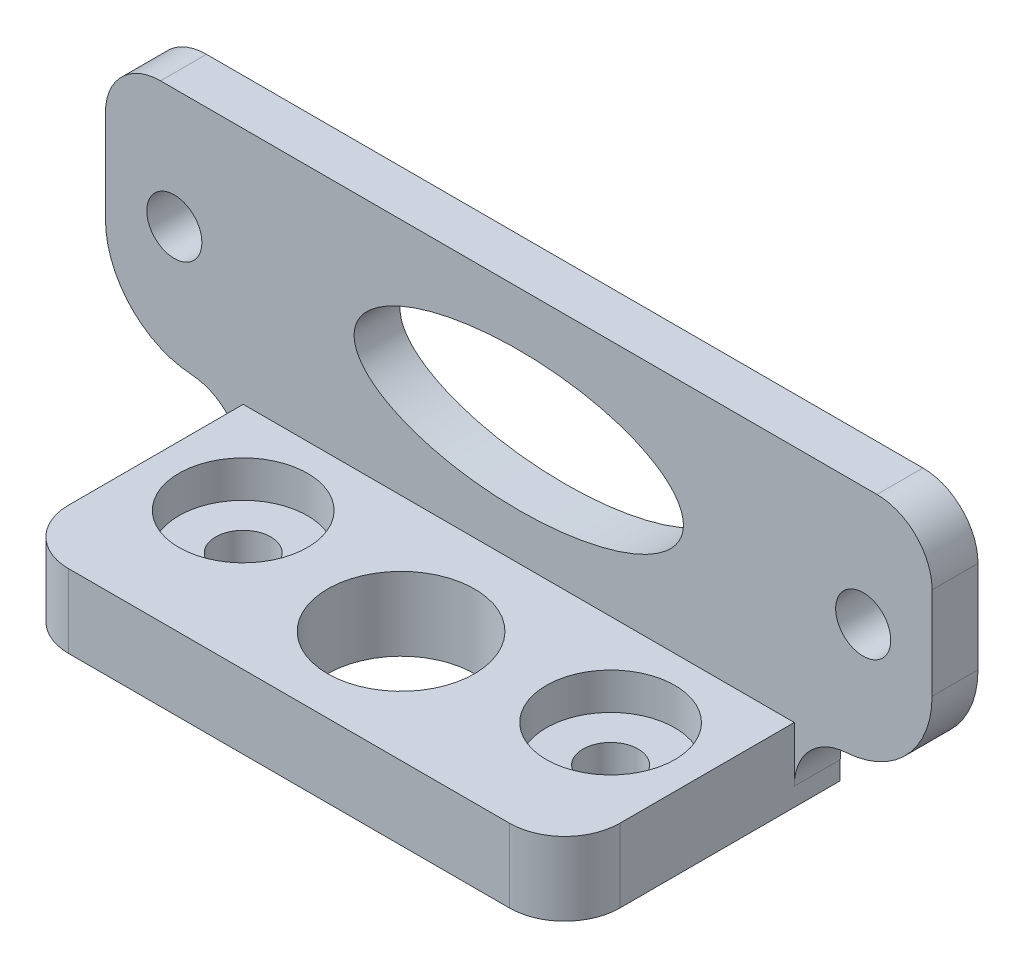
ISO-10303-21;
HEADER;
FILE_DESCRIPTION(('STEP AP214'),'2;1');
FILE_NAME('part.step','',(''),(''),'','','');
FILE_SCHEMA(('AUTOMOTIVE_DESIGN { 1 0 10303 214 1 1 1 1 }'));
ENDSEC;
DATA;
#1=APPLICATION_CONTEXT('core data for automotive mechanical design processes');
#2=APPLICATION_PROTOCOL_DEFINITION('international standard','automotive_design',2000,#1);
#3=PRODUCT_CONTEXT('',#1,'mechanical');
#4=PRODUCT('Part','Part','',(#3));
#5=PRODUCT_RELATED_PRODUCT_CATEGORY('part','',(#4));
#6=PRODUCT_DEFINITION_FORMATION('','',#4);
#7=PRODUCT_DEFINITION_CONTEXT('part definition',#1,'design');
#8=PRODUCT_DEFINITION('design','',#6,#7);
#9=PRODUCT_DEFINITION_SHAPE('','',#8);
#10=(LENGTH_UNIT() NAMED_UNIT(*) SI_UNIT(.MILLI.,.METRE.));
#11=(NAMED_UNIT(*) PLANE_ANGLE_UNIT() SI_UNIT($,.RADIAN.));
#12=(NAMED_UNIT(*) SI_UNIT($,.STERADIAN.) SOLID_ANGLE_UNIT());
#13=UNCERTAINTY_MEASURE_WITH_UNIT(LENGTH_MEASURE(1.E-05),#10,'distance_accuracy_value','');
#14=(GEOMETRIC_REPRESENTATION_CONTEXT(3) GLOBAL_UNCERTAINTY_ASSIGNED_CONTEXT((#13)) GLOBAL_UNIT_ASSIGNED_CONTEXT((#10,
#11,#12)) REPRESENTATION_CONTEXT('',''));
#15=CARTESIAN_POINT('',(0.,0.,0.));
#16=DIRECTION('',(0.,0.,1.));
#17=DIRECTION('',(1.,0.,0.));
#18=AXIS2_PLACEMENT_3D('',#15,#16,#17);
#19=CARTESIAN_POINT('',(-10.,-21.,0.));
#20=DIRECTION('',(0.,1.,0.));
#21=DIRECTION('',(0.,0.,1.));
#22=AXIS2_PLACEMENT_3D('',#19,#20,#21);
#23=CYLINDRICAL_SURFACE('',#22,1.5);
#24=CARTESIAN_POINT('',(-10.,0.,0.));
#25=DIRECTION('',(0.,1.,0.));
#26=DIRECTION('',(0.,0.,1.));
#27=AXIS2_PLACEMENT_3D('',#24,#25,#26);
#28=CIRCLE('',#27,1.5);
#29=CARTESIAN_POINT('',(-10.,0.,1.5));
#30=VERTEX_POINT('',#29);
#31=EDGE_CURVE('E263',#30,#30,#28,.T.);
#32=ORIENTED_EDGE('',*,*,#31,.F.);
#33=EDGE_LOOP('',(#32));
#34=FACE_BOUND('',#33,.T.);
#35=CARTESIAN_POINT('',(-10.,2.,0.));
#36=DIRECTION('',(0.,1.,0.));
#37=DIRECTION('',(0.,0.,1.));
#38=AXIS2_PLACEMENT_3D('',#35,#36,#37);
#39=CIRCLE('',#38,1.5);
#40=CARTESIAN_POINT('',(-10.,2.,1.5));
#41=VERTEX_POINT('',#40);
#42=EDGE_CURVE('E270',#41,#41,#39,.F.);
#43=ORIENTED_EDGE('',*,*,#42,.F.);
#44=EDGE_LOOP('',(#43));
#45=FACE_BOUND('',#44,.T.);
#46=ADVANCED_FACE('F34',(#34,#45),#23,.F.);
#47=CARTESIAN_POINT('',(10.,-21.,0.));
#48=DIRECTION('',(0.,1.,0.));
#49=DIRECTION('',(0.,0.,1.));
#50=AXIS2_PLACEMENT_3D('',#47,#48,#49);
#51=CYLINDRICAL_SURFACE('',#50,1.5);
#52=CARTESIAN_POINT('',(10.,0.,0.));
#53=DIRECTION('',(0.,1.,0.));
#54=DIRECTION('',(0.,0.,1.));
#55=AXIS2_PLACEMENT_3D('',#52,#53,#54);
#56=CIRCLE('',#55,1.5);
#57=CARTESIAN_POINT('',(10.,0.,1.5));
#58=VERTEX_POINT('',#57);
#59=EDGE_CURVE('E259',#58,#58,#56,.T.);
#60=ORIENTED_EDGE('',*,*,#59,.F.);
#61=EDGE_LOOP('',(#60));
#62=FACE_BOUND('',#61,.T.);
#63=CARTESIAN_POINT('',(10.,2.,0.));
#64=DIRECTION('',(0.,1.,0.));
#65=DIRECTION('',(0.,0.,1.));
#66=AXIS2_PLACEMENT_3D('',#63,#64,#65);
#67=CIRCLE('',#66,1.5);
#68=CARTESIAN_POINT('',(10.,2.,1.5));
#69=VERTEX_POINT('',#68);
#70=EDGE_CURVE('E266',#69,#69,#67,.F.);
#71=ORIENTED_EDGE('',*,*,#70,.F.);
#72=EDGE_LOOP('',(#71));
#73=FACE_BOUND('',#72,.T.);
#74=ADVANCED_FACE('F361',(#62,#73),#51,.F.);
#75=CARTESIAN_POINT('',(15.,4.,-7.5));
#76=DIRECTION('',(-1.,0.,0.));
#77=DIRECTION('',(0.,0.,1.));
#78=AXIS2_PLACEMENT_3D('',#75,#76,#77);
#79=PLANE('',#78);
#80=DIRECTION('',(0.,0.,-1.));
#81=VECTOR('',#80,1.);
#82=CARTESIAN_POINT('',(15.,4.,-7.5));
#83=LINE('',#82,#81);
#84=CARTESIAN_POINT('',(15.,4.,4.5));
#85=VERTEX_POINT('',#84);
#86=CARTESIAN_POINT('',(15.,4.,-5.));
#87=VERTEX_POINT('',#86);
#88=EDGE_CURVE('E151',#85,#87,#83,.T.);
#89=ORIENTED_EDGE('',*,*,#88,.F.);
#90=DIRECTION('',(0.,-1.,0.));
#91=VECTOR('',#90,1.);
#92=CARTESIAN_POINT('',(15.,4.,4.5));
#93=LINE('',#92,#91);
#94=CARTESIAN_POINT('',(15.,0.,4.5));
#95=VERTEX_POINT('',#94);
#96=EDGE_CURVE('E229',#85,#95,#93,.T.);
#97=ORIENTED_EDGE('',*,*,#96,.T.);
#98=DIRECTION('',(0.,0.,-1.));
#99=VECTOR('',#98,1.);
#100=CARTESIAN_POINT('',(15.,0.,-7.5));
#101=LINE('',#100,#99);
#102=CARTESIAN_POINT('',(15.,0.,-7.5));
#103=VERTEX_POINT('',#102);
#104=EDGE_CURVE('E198',#95,#103,#101,.T.);
#105=ORIENTED_EDGE('',*,*,#104,.T.);
#106=DIRECTION('',(0.,-1.,0.));
#107=VECTOR('',#106,1.);
#108=CARTESIAN_POINT('',(15.,4.,-7.5));
#109=LINE('',#108,#107);
#110=CARTESIAN_POINT('',(15.,1.,-7.5));
#111=VERTEX_POINT('',#110);
#112=EDGE_CURVE('E179',#111,#103,#109,.T.);
#113=ORIENTED_EDGE('',*,*,#112,.F.);
#114=DIRECTION('',(0.,0.,-1.));
#115=VECTOR('',#114,1.);
#116=CARTESIAN_POINT('',(15.,1.,-5.));
#117=LINE('',#116,#115);
#118=CARTESIAN_POINT('',(15.,1.,-5.));
#119=VERTEX_POINT('',#118);
#120=EDGE_CURVE('E155',#111,#119,#117,.F.);
#121=ORIENTED_EDGE('',*,*,#120,.T.);
#122=DIRECTION('',(0.,1.,0.));
#123=VECTOR('',#122,1.);
#124=CARTESIAN_POINT('',(15.,17.,-5.));
#125=LINE('',#124,#123);
#126=EDGE_CURVE('E147',#119,#87,#125,.T.);
#127=ORIENTED_EDGE('',*,*,#126,.T.);
#128=EDGE_LOOP('',(#89,#97,#105,#113,#121,#127));
#129=FACE_BOUND('',#128,.T.);
#130=ADVANCED_FACE('F149',(#129),#79,.F.);
#131=CARTESIAN_POINT('',(-15.,4.,-7.5));
#132=DIRECTION('',(0.,0.,1.));
#133=DIRECTION('',(1.,0.,0.));
#134=AXIS2_PLACEMENT_3D('',#131,#132,#133);
#135=PLANE('',#134);
#136=CARTESIAN_POINT('',(0.,10.2840234102692,-7.5));
#137=DIRECTION('',(0.,0.,1.));
#138=DIRECTION('',(1.,0.,0.));
#139=AXIS2_PLACEMENT_3D('',#136,#137,#138);
#140=ELLIPSE('',#139,8.96209407276448,3.77793192762906);
#141=CARTESIAN_POINT('',(8.96209407276448,10.2840234102692,-7.5));
#142=VERTEX_POINT('',#141);
#143=EDGE_CURVE('E324',#142,#142,#140,.T.);
#144=ORIENTED_EDGE('',*,*,#143,.T.);
#145=EDGE_LOOP('',(#144));
#146=FACE_BOUND('',#145,.T.);
#147=CARTESIAN_POINT('',(-18.75,10.5,-7.5));
#148=DIRECTION('',(0.,0.,1.));
#149=DIRECTION('',(1.,0.,0.));
#150=AXIS2_PLACEMENT_3D('',#147,#148,#149);
#151=CIRCLE('',#150,1.5);
#152=CARTESIAN_POINT('',(-17.25,10.5,-7.5));
#153=VERTEX_POINT('',#152);
#154=EDGE_CURVE('E312',#153,#153,#151,.T.);
#155=ORIENTED_EDGE('',*,*,#154,.T.);
#156=EDGE_LOOP('',(#155));
#157=FACE_BOUND('',#156,.T.);
#158=CARTESIAN_POINT('',(18.75,10.5,-7.5));
#159=DIRECTION('',(0.,0.,1.));
#160=DIRECTION('',(1.,0.,0.));
#161=AXIS2_PLACEMENT_3D('',#158,#159,#160);
#162=CIRCLE('',#161,1.5);
#163=CARTESIAN_POINT('',(20.25,10.5,-7.5));
#164=VERTEX_POINT('',#163);
#165=EDGE_CURVE('E305',#164,#164,#162,.T.);
#166=ORIENTED_EDGE('',*,*,#165,.T.);
#167=EDGE_LOOP('',(#166));
#168=FACE_BOUND('',#167,.T.);
#169=CARTESIAN_POINT('',(-18.,1.,-7.5));
#170=DIRECTION('',(0.,0.,1.));
#171=DIRECTION('',(1.,0.,0.));
#172=AXIS2_PLACEMENT_3D('',#169,#170,#171);
#173=CIRCLE('',#172,3.);
#174=CARTESIAN_POINT('',(-15.,1.,-7.5));
#175=VERTEX_POINT('',#174);
#176=CARTESIAN_POINT('',(-17.8125,3.99413489175087,-7.5));
#177=VERTEX_POINT('',#176);
#178=EDGE_CURVE('E255',#175,#177,#173,.T.);
#179=ORIENTED_EDGE('',*,*,#178,.T.);
#180=CARTESIAN_POINT('',(-17.5,8.98435971133565,-7.5));
#181=DIRECTION('',(0.,0.,1.));
#182=DIRECTION('',(1.,0.,0.));
#183=AXIS2_PLACEMENT_3D('',#180,#181,#182);
#184=CIRCLE('',#183,5.);
#185=CARTESIAN_POINT('',(-22.5,8.98435971133566,-7.5));
#186=VERTEX_POINT('',#185);
#187=EDGE_CURVE('E284',#177,#186,#184,.F.);
#188=ORIENTED_EDGE('',*,*,#187,.T.);
#189=DIRECTION('',(0.,-1.,0.));
#190=VECTOR('',#189,1.);
#191=CARTESIAN_POINT('',(-22.5,17.,-7.5));
#192=LINE('',#191,#190);
#193=CARTESIAN_POINT('',(-22.5,14.,-7.5));
#194=VERTEX_POINT('',#193);
#195=EDGE_CURVE('E194',#194,#186,#192,.T.);
#196=ORIENTED_EDGE('',*,*,#195,.F.);
#197=CARTESIAN_POINT('',(-19.5,14.,-7.5));
#198=DIRECTION('',(0.,0.,1.));
#199=DIRECTION('',(1.,0.,0.));
#200=AXIS2_PLACEMENT_3D('',#197,#198,#199);
#201=CIRCLE('',#200,3.);
#202=CARTESIAN_POINT('',(-19.5,17.,-7.5));
#203=VERTEX_POINT('',#202);
#204=EDGE_CURVE('E245',#194,#203,#201,.F.);
#205=ORIENTED_EDGE('',*,*,#204,.T.);
#206=DIRECTION('',(-1.,0.,0.));
#207=VECTOR('',#206,1.);
#208=CARTESIAN_POINT('',(-22.5,17.,-7.5));
#209=LINE('',#208,#207);
#210=CARTESIAN_POINT('',(19.5,17.,-7.5));
#211=VERTEX_POINT('',#210);
#212=EDGE_CURVE('E295',#211,#203,#209,.T.);
#213=ORIENTED_EDGE('',*,*,#212,.F.);
#214=CARTESIAN_POINT('',(19.5,14.,-7.5));
#215=DIRECTION('',(0.,0.,1.));
#216=DIRECTION('',(1.,0.,0.));
#217=AXIS2_PLACEMENT_3D('',#214,#215,#216);
#218=CIRCLE('',#217,3.);
#219=CARTESIAN_POINT('',(22.5,14.,-7.5));
#220=VERTEX_POINT('',#219);
#221=EDGE_CURVE('E243',#211,#220,#218,.F.);
#222=ORIENTED_EDGE('',*,*,#221,.T.);
#223=DIRECTION('',(0.,-1.,0.));
#224=VECTOR('',#223,1.);
#225=CARTESIAN_POINT('',(22.5,17.,-7.5));
#226=LINE('',#225,#224);
#227=CARTESIAN_POINT('',(22.5,8.98435971133566,-7.5));
#228=VERTEX_POINT('',#227);
#229=EDGE_CURVE('E197',#220,#228,#226,.T.);
#230=ORIENTED_EDGE('',*,*,#229,.T.);
#231=CARTESIAN_POINT('',(17.5,8.98435971133565,-7.5));
#232=DIRECTION('',(0.,0.,1.));
#233=DIRECTION('',(1.,0.,0.));
#234=AXIS2_PLACEMENT_3D('',#231,#232,#233);
#235=CIRCLE('',#234,5.);
#236=CARTESIAN_POINT('',(17.8125,3.99413489175087,-7.5));
#237=VERTEX_POINT('',#236);
#238=EDGE_CURVE('E50',#228,#237,#235,.F.);
#239=ORIENTED_EDGE('',*,*,#238,.T.);
#240=CARTESIAN_POINT('',(18.,1.,-7.5));
#241=DIRECTION('',(0.,0.,1.));
#242=DIRECTION('',(1.,0.,0.));
#243=AXIS2_PLACEMENT_3D('',#240,#241,#242);
#244=CIRCLE('',#243,3.);
#245=EDGE_CURVE('E249',#237,#111,#244,.T.);
#246=ORIENTED_EDGE('',*,*,#245,.T.);
#247=ORIENTED_EDGE('',*,*,#112,.T.);
#248=DIRECTION('',(-1.,0.,0.));
#249=VECTOR('',#248,1.);
#250=CARTESIAN_POINT('',(-15.,0.,-7.5));
#251=LINE('',#250,#249);
#252=CARTESIAN_POINT('',(-15.,0.,-7.5));
#253=VERTEX_POINT('',#252);
#254=EDGE_CURVE('E205',#103,#253,#251,.T.);
#255=ORIENTED_EDGE('',*,*,#254,.T.);
#256=DIRECTION('',(0.,-1.,0.));
#257=VECTOR('',#256,1.);
#258=CARTESIAN_POINT('',(-15.,4.,-7.5));
#259=LINE('',#258,#257);
#260=EDGE_CURVE('E183',#175,#253,#259,.T.);
#261=ORIENTED_EDGE('',*,*,#260,.F.);
#262=EDGE_LOOP('',(#179,#188,#196,#205,#213,#222,#230,#239,#246,#247,#255,#261));
#263=FACE_BOUND('',#262,.T.);
#264=ADVANCED_FACE('F292',(#146,#157,#168,#263),#135,.F.);
#265=CARTESIAN_POINT('',(-15.,4.,-7.5));
#266=DIRECTION('',(1.,0.,0.));
#267=DIRECTION('',(0.,0.,-1.));
#268=AXIS2_PLACEMENT_3D('',#265,#266,#267);
#269=PLANE('',#268);
#270=DIRECTION('',(0.,0.,1.));
#271=VECTOR('',#270,1.);
#272=CARTESIAN_POINT('',(-15.,0.,-7.5));
#273=LINE('',#272,#271);
#274=CARTESIAN_POINT('',(-15.,0.,4.5));
#275=VERTEX_POINT('',#274);
#276=EDGE_CURVE('E208',#253,#275,#273,.T.);
#277=ORIENTED_EDGE('',*,*,#276,.T.);
#278=DIRECTION('',(0.,-1.,0.));
#279=VECTOR('',#278,1.);
#280=CARTESIAN_POINT('',(-15.,4.,4.5));
#281=LINE('',#280,#279);
#282=CARTESIAN_POINT('',(-15.,4.,4.5));
#283=VERTEX_POINT('',#282);
#284=EDGE_CURVE('E224',#275,#283,#281,.F.);
#285=ORIENTED_EDGE('',*,*,#284,.T.);
#286=DIRECTION('',(0.,0.,1.));
#287=VECTOR('',#286,1.);
#288=CARTESIAN_POINT('',(-15.,4.,-7.5));
#289=LINE('',#288,#287);
#290=CARTESIAN_POINT('',(-15.,4.,-5.));
#291=VERTEX_POINT('',#290);
#292=EDGE_CURVE('E170',#291,#283,#289,.T.);
#293=ORIENTED_EDGE('',*,*,#292,.F.);
#294=DIRECTION('',(0.,-1.,0.));
#295=VECTOR('',#294,1.);
#296=CARTESIAN_POINT('',(-15.,17.,-5.));
#297=LINE('',#296,#295);
#298=CARTESIAN_POINT('',(-15.,1.,-5.));
#299=VERTEX_POINT('',#298);
#300=EDGE_CURVE('E176',#291,#299,#297,.T.);
#301=ORIENTED_EDGE('',*,*,#300,.T.);
#302=DIRECTION('',(0.,0.,1.));
#303=VECTOR('',#302,1.);
#304=CARTESIAN_POINT('',(-15.,1.,-7.5));
#305=LINE('',#304,#303);
#306=EDGE_CURVE('E221',#299,#175,#305,.F.);
#307=ORIENTED_EDGE('',*,*,#306,.T.);
#308=ORIENTED_EDGE('',*,*,#260,.T.);
#309=EDGE_LOOP('',(#277,#285,#293,#301,#307,#308));
#310=FACE_BOUND('',#309,.T.);
#311=ADVANCED_FACE('F396',(#310),#269,.F.);
#312=CARTESIAN_POINT('',(-15.,4.,7.5));
#313=DIRECTION('',(0.,0.,-1.));
#314=DIRECTION('',(-1.,0.,0.));
#315=AXIS2_PLACEMENT_3D('',#312,#313,#314);
#316=PLANE('',#315);
#317=DIRECTION('',(1.,0.,0.));
#318=VECTOR('',#317,1.);
#319=CARTESIAN_POINT('',(-15.,4.,7.5));
#320=LINE('',#319,#318);
#321=CARTESIAN_POINT('',(-12.,4.,7.5));
#322=VERTEX_POINT('',#321);
#323=CARTESIAN_POINT('',(12.,4.,7.5));
#324=VERTEX_POINT('',#323);
#325=EDGE_CURVE('E201',#322,#324,#320,.T.);
#326=ORIENTED_EDGE('',*,*,#325,.F.);
#327=DIRECTION('',(0.,-1.,0.));
#328=VECTOR('',#327,1.);
#329=CARTESIAN_POINT('',(-12.,4.,7.5));
#330=LINE('',#329,#328);
#331=CARTESIAN_POINT('',(-12.,0.,7.5));
#332=VERTEX_POINT('',#331);
#333=EDGE_CURVE('E181',#322,#332,#330,.T.);
#334=ORIENTED_EDGE('',*,*,#333,.T.);
#335=DIRECTION('',(1.,0.,0.));
#336=VECTOR('',#335,1.);
#337=CARTESIAN_POINT('',(-15.,0.,7.5));
#338=LINE('',#337,#336);
#339=CARTESIAN_POINT('',(12.,0.,7.5));
#340=VERTEX_POINT('',#339);
#341=EDGE_CURVE('E171',#332,#340,#338,.T.);
#342=ORIENTED_EDGE('',*,*,#341,.T.);
#343=DIRECTION('',(0.,-1.,0.));
#344=VECTOR('',#343,1.);
#345=CARTESIAN_POINT('',(12.,4.,7.5));
#346=LINE('',#345,#344);
#347=EDGE_CURVE('E178',#340,#324,#346,.F.);
#348=ORIENTED_EDGE('',*,*,#347,.T.);
#349=EDGE_LOOP('',(#326,#334,#342,#348));
#350=FACE_BOUND('',#349,.T.);
#351=ADVANCED_FACE('F389',(#350),#316,.F.);
#352=CARTESIAN_POINT('',(0.,4.,0.));
#353=DIRECTION('',(0.,1.,0.));
#354=DIRECTION('',(0.,0.,1.));
#355=AXIS2_PLACEMENT_3D('',#352,#353,#354);
#356=PLANE('',#355);
#357=CARTESIAN_POINT('',(0.,4.,1.4062302175064));
#358=DIRECTION('',(0.,1.,0.));
#359=DIRECTION('',(0.,0.,1.));
#360=AXIS2_PLACEMENT_3D('',#357,#358,#359);
#361=CIRCLE('',#360,4.);
#362=CARTESIAN_POINT('',(0.,4.,5.4062302175064));
#363=VERTEX_POINT('',#362);
#364=EDGE_CURVE('E334',#363,#363,#361,.T.);
#365=ORIENTED_EDGE('',*,*,#364,.F.);
#366=EDGE_LOOP('',(#365));
#367=FACE_BOUND('',#366,.T.);
#368=CARTESIAN_POINT('',(-10.,4.,0.));
#369=DIRECTION('',(0.,1.,0.));
#370=DIRECTION('',(0.,0.,1.));
#371=AXIS2_PLACEMENT_3D('',#368,#369,#370);
#372=CIRCLE('',#371,3.5);
#373=CARTESIAN_POINT('',(-10.,4.,3.5));
#374=VERTEX_POINT('',#373);
#375=EDGE_CURVE('E321',#374,#374,#372,.T.);
#376=ORIENTED_EDGE('',*,*,#375,.F.);
#377=EDGE_LOOP('',(#376));
#378=FACE_BOUND('',#377,.T.);
#379=CARTESIAN_POINT('',(10.,4.,0.));
#380=DIRECTION('',(0.,1.,0.));
#381=DIRECTION('',(0.,0.,1.));
#382=AXIS2_PLACEMENT_3D('',#379,#380,#381);
#383=CIRCLE('',#382,3.5);
#384=CARTESIAN_POINT('',(10.,4.,3.5));
#385=VERTEX_POINT('',#384);
#386=EDGE_CURVE('E273',#385,#385,#383,.T.);
#387=ORIENTED_EDGE('',*,*,#386,.F.);
#388=EDGE_LOOP('',(#387));
#389=FACE_BOUND('',#388,.T.);
#390=ORIENTED_EDGE('',*,*,#292,.T.);
#391=CARTESIAN_POINT('',(-12.,4.,4.5));
#392=DIRECTION('',(0.,1.,0.));
#393=DIRECTION('',(0.,0.,1.));
#394=AXIS2_PLACEMENT_3D('',#391,#392,#393);
#395=CIRCLE('',#394,3.);
#396=EDGE_CURVE('E160',#283,#322,#395,.T.);
#397=ORIENTED_EDGE('',*,*,#396,.T.);
#398=ORIENTED_EDGE('',*,*,#325,.T.);
#399=CARTESIAN_POINT('',(12.,4.,4.5));
#400=DIRECTION('',(0.,1.,0.));
#401=DIRECTION('',(0.,0.,1.));
#402=AXIS2_PLACEMENT_3D('',#399,#400,#401);
#403=CIRCLE('',#402,3.);
#404=EDGE_CURVE('E169',#324,#85,#403,.T.);
#405=ORIENTED_EDGE('',*,*,#404,.T.);
#406=ORIENTED_EDGE('',*,*,#88,.T.);
#407=DIRECTION('',(1.,0.,0.));
#408=VECTOR('',#407,1.);
#409=CARTESIAN_POINT('',(-22.5,4.,-5.));
#410=LINE('',#409,#408);
#411=EDGE_CURVE('E166',#291,#87,#410,.T.);
#412=ORIENTED_EDGE('',*,*,#411,.F.);
#413=EDGE_LOOP('',(#390,#397,#398,#405,#406,#412));
#414=FACE_BOUND('',#413,.T.);
#415=ADVANCED_FACE('F165',(#367,#378,#389,#414),#356,.T.);
#416=CARTESIAN_POINT('',(0.,0.,0.));
#417=DIRECTION('',(0.,1.,0.));
#418=DIRECTION('',(0.,0.,1.));
#419=AXIS2_PLACEMENT_3D('',#416,#417,#418);
#420=PLANE('',#419);
#421=CARTESIAN_POINT('',(0.,0.,1.4062302175064));
#422=DIRECTION('',(0.,1.,0.));
#423=DIRECTION('',(0.,0.,1.));
#424=AXIS2_PLACEMENT_3D('',#421,#422,#423);
#425=CIRCLE('',#424,4.);
#426=CARTESIAN_POINT('',(0.,0.,5.4062302175064));
#427=VERTEX_POINT('',#426);
#428=EDGE_CURVE('E38',#427,#427,#425,.T.);
#429=ORIENTED_EDGE('',*,*,#428,.T.);
#430=EDGE_LOOP('',(#429));
#431=FACE_BOUND('',#430,.T.);
#432=ORIENTED_EDGE('',*,*,#31,.T.);
#433=EDGE_LOOP('',(#432));
#434=FACE_BOUND('',#433,.T.);
#435=ORIENTED_EDGE('',*,*,#59,.T.);
#436=EDGE_LOOP('',(#435));
#437=FACE_BOUND('',#436,.T.);
#438=ORIENTED_EDGE('',*,*,#341,.F.);
#439=CARTESIAN_POINT('',(-12.,0.,4.5));
#440=DIRECTION('',(0.,1.,0.));
#441=DIRECTION('',(0.,0.,1.));
#442=AXIS2_PLACEMENT_3D('',#439,#440,#441);
#443=CIRCLE('',#442,3.);
#444=EDGE_CURVE('E219',#332,#275,#443,.F.);
#445=ORIENTED_EDGE('',*,*,#444,.T.);
#446=ORIENTED_EDGE('',*,*,#276,.F.);
#447=ORIENTED_EDGE('',*,*,#254,.F.);
#448=ORIENTED_EDGE('',*,*,#104,.F.);
#449=CARTESIAN_POINT('',(12.,0.,4.5));
#450=DIRECTION('',(0.,1.,0.));
#451=DIRECTION('',(0.,0.,1.));
#452=AXIS2_PLACEMENT_3D('',#449,#450,#451);
#453=CIRCLE('',#452,3.);
#454=EDGE_CURVE('E453',#95,#340,#453,.F.);
#455=ORIENTED_EDGE('',*,*,#454,.T.);
#456=EDGE_LOOP('',(#438,#445,#446,#447,#448,#455));
#457=FACE_BOUND('',#456,.T.);
#458=ADVANCED_FACE('F386',(#431,#434,#437,#457),#420,.F.);
#459=CARTESIAN_POINT('',(22.5,17.,-7.5));
#460=DIRECTION('',(-1.,0.,0.));
#461=DIRECTION('',(0.,0.,1.));
#462=AXIS2_PLACEMENT_3D('',#459,#460,#461);
#463=PLANE('',#462);
#464=DIRECTION('',(0.,-1.,0.));
#465=VECTOR('',#464,1.);
#466=CARTESIAN_POINT('',(22.5,17.,-5.));
#467=LINE('',#466,#465);
#468=CARTESIAN_POINT('',(22.5,14.,-5.));
#469=VERTEX_POINT('',#468);
#470=CARTESIAN_POINT('',(22.5,8.98435971133566,-5.));
#471=VERTEX_POINT('',#470);
#472=EDGE_CURVE('E189',#469,#471,#467,.T.);
#473=ORIENTED_EDGE('',*,*,#472,.T.);
#474=DIRECTION('',(0.,0.,1.));
#475=VECTOR('',#474,1.);
#476=CARTESIAN_POINT('',(22.5,8.98435971133565,-7.5));
#477=LINE('',#476,#475);
#478=EDGE_CURVE('E43',#471,#228,#477,.F.);
#479=ORIENTED_EDGE('',*,*,#478,.T.);
#480=ORIENTED_EDGE('',*,*,#229,.F.);
#481=DIRECTION('',(0.,0.,-1.));
#482=VECTOR('',#481,1.);
#483=CARTESIAN_POINT('',(22.5,14.,-5.));
#484=LINE('',#483,#482);
#485=EDGE_CURVE('E247',#220,#469,#484,.F.);
#486=ORIENTED_EDGE('',*,*,#485,.T.);
#487=EDGE_LOOP('',(#473,#479,#480,#486));
#488=FACE_BOUND('',#487,.T.);
#489=ADVANCED_FACE('F288',(#488),#463,.F.);
#490=CARTESIAN_POINT('',(-22.5,17.,-7.5));
#491=DIRECTION('',(1.,0.,0.));
#492=DIRECTION('',(0.,0.,-1.));
#493=AXIS2_PLACEMENT_3D('',#490,#491,#492);
#494=PLANE('',#493);
#495=ORIENTED_EDGE('',*,*,#195,.T.);
#496=DIRECTION('',(0.,0.,-1.));
#497=VECTOR('',#496,1.);
#498=CARTESIAN_POINT('',(-22.5,8.98435971133565,-7.5));
#499=LINE('',#498,#497);
#500=CARTESIAN_POINT('',(-22.5,8.98435971133566,-5.));
#501=VERTEX_POINT('',#500);
#502=EDGE_CURVE('E258',#186,#501,#499,.F.);
#503=ORIENTED_EDGE('',*,*,#502,.T.);
#504=DIRECTION('',(0.,-1.,0.));
#505=VECTOR('',#504,1.);
#506=CARTESIAN_POINT('',(-22.5,17.,-5.));
#507=LINE('',#506,#505);
#508=CARTESIAN_POINT('',(-22.5,14.,-5.));
#509=VERTEX_POINT('',#508);
#510=EDGE_CURVE('E192',#509,#501,#507,.T.);
#511=ORIENTED_EDGE('',*,*,#510,.F.);
#512=DIRECTION('',(0.,0.,1.));
#513=VECTOR('',#512,1.);
#514=CARTESIAN_POINT('',(-22.5,14.,-7.5));
#515=LINE('',#514,#513);
#516=EDGE_CURVE('E241',#509,#194,#515,.F.);
#517=ORIENTED_EDGE('',*,*,#516,.T.);
#518=EDGE_LOOP('',(#495,#503,#511,#517));
#519=FACE_BOUND('',#518,.T.);
#520=ADVANCED_FACE('F379',(#519),#494,.F.);
#521=CARTESIAN_POINT('',(-22.5,17.,-5.));
#522=DIRECTION('',(0.,0.,-1.));
#523=DIRECTION('',(-1.,0.,0.));
#524=AXIS2_PLACEMENT_3D('',#521,#522,#523);
#525=PLANE('',#524);
#526=CARTESIAN_POINT('',(0.,10.2840234102692,-5.));
#527=DIRECTION('',(0.,0.,1.));
#528=DIRECTION('',(1.,0.,0.));
#529=AXIS2_PLACEMENT_3D('',#526,#527,#528);
#530=ELLIPSE('',#529,8.96209407276448,3.77793192762906);
#531=CARTESIAN_POINT('',(8.96209407276448,10.2840234102692,-5.));
#532=VERTEX_POINT('',#531);
#533=EDGE_CURVE('E329',#532,#532,#530,.T.);
#534=ORIENTED_EDGE('',*,*,#533,.F.);
#535=EDGE_LOOP('',(#534));
#536=FACE_BOUND('',#535,.T.);
#537=CARTESIAN_POINT('',(-18.75,10.5,-5.));
#538=DIRECTION('',(0.,0.,1.));
#539=DIRECTION('',(-1.,0.,0.));
#540=AXIS2_PLACEMENT_3D('',#537,#538,#539);
#541=CIRCLE('',#540,1.5);
#542=CARTESIAN_POINT('',(-20.25,10.5,-5.));
#543=VERTEX_POINT('',#542);
#544=EDGE_CURVE('E262',#543,#543,#541,.T.);
#545=ORIENTED_EDGE('',*,*,#544,.F.);
#546=EDGE_LOOP('',(#545));
#547=FACE_BOUND('',#546,.T.);
#548=CARTESIAN_POINT('',(18.75,10.5,-5.));
#549=DIRECTION('',(0.,0.,1.));
#550=DIRECTION('',(1.,0.,0.));
#551=AXIS2_PLACEMENT_3D('',#548,#549,#550);
#552=CIRCLE('',#551,1.5);
#553=CARTESIAN_POINT('',(20.25,10.5,-5.));
#554=VERTEX_POINT('',#553);
#555=EDGE_CURVE('E307',#554,#554,#552,.T.);
#556=ORIENTED_EDGE('',*,*,#555,.F.);
#557=EDGE_LOOP('',(#556));
#558=FACE_BOUND('',#557,.T.);
#559=ORIENTED_EDGE('',*,*,#510,.T.);
#560=CARTESIAN_POINT('',(-17.5,8.98435971133565,-5.));
#561=DIRECTION('',(0.,0.,-1.));
#562=DIRECTION('',(-1.,0.,0.));
#563=AXIS2_PLACEMENT_3D('',#560,#561,#562);
#564=CIRCLE('',#563,5.);
#565=CARTESIAN_POINT('',(-17.8125,3.99413489175087,-5.));
#566=VERTEX_POINT('',#565);
#567=EDGE_CURVE('E279',#501,#566,#564,.F.);
#568=ORIENTED_EDGE('',*,*,#567,.T.);
#569=CARTESIAN_POINT('',(-18.,1.,-5.));
#570=DIRECTION('',(0.,0.,-1.));
#571=DIRECTION('',(-1.,0.,0.));
#572=AXIS2_PLACEMENT_3D('',#569,#570,#571);
#573=CIRCLE('',#572,3.);
#574=EDGE_CURVE('E253',#566,#299,#573,.T.);
#575=ORIENTED_EDGE('',*,*,#574,.T.);
#576=ORIENTED_EDGE('',*,*,#300,.F.);
#577=ORIENTED_EDGE('',*,*,#411,.T.);
#578=ORIENTED_EDGE('',*,*,#126,.F.);
#579=CARTESIAN_POINT('',(18.,1.,-5.));
#580=DIRECTION('',(0.,0.,-1.));
#581=DIRECTION('',(-1.,0.,0.));
#582=AXIS2_PLACEMENT_3D('',#579,#580,#581);
#583=CIRCLE('',#582,3.);
#584=CARTESIAN_POINT('',(17.8125,3.99413489175087,-5.));
#585=VERTEX_POINT('',#584);
#586=EDGE_CURVE('E251',#119,#585,#583,.T.);
#587=ORIENTED_EDGE('',*,*,#586,.T.);
#588=CARTESIAN_POINT('',(17.5,8.98435971133565,-5.));
#589=DIRECTION('',(0.,0.,-1.));
#590=DIRECTION('',(-1.,0.,0.));
#591=AXIS2_PLACEMENT_3D('',#588,#589,#590);
#592=CIRCLE('',#591,5.);
#593=EDGE_CURVE('E277',#585,#471,#592,.F.);
#594=ORIENTED_EDGE('',*,*,#593,.T.);
#595=ORIENTED_EDGE('',*,*,#472,.F.);
#596=CARTESIAN_POINT('',(19.5,14.,-5.));
#597=DIRECTION('',(0.,0.,-1.));
#598=DIRECTION('',(-1.,0.,0.));
#599=AXIS2_PLACEMENT_3D('',#596,#597,#598);
#600=CIRCLE('',#599,3.);
#601=CARTESIAN_POINT('',(19.5,17.,-5.));
#602=VERTEX_POINT('',#601);
#603=EDGE_CURVE('E237',#469,#602,#600,.F.);
#604=ORIENTED_EDGE('',*,*,#603,.T.);
#605=DIRECTION('',(1.,0.,0.));
#606=VECTOR('',#605,1.);
#607=CARTESIAN_POINT('',(-22.5,17.,-5.));
#608=LINE('',#607,#606);
#609=CARTESIAN_POINT('',(-19.5,17.,-5.));
#610=VERTEX_POINT('',#609);
#611=EDGE_CURVE('E187',#610,#602,#608,.T.);
#612=ORIENTED_EDGE('',*,*,#611,.F.);
#613=CARTESIAN_POINT('',(-19.5,14.,-5.));
#614=DIRECTION('',(0.,0.,-1.));
#615=DIRECTION('',(-1.,0.,0.));
#616=AXIS2_PLACEMENT_3D('',#613,#614,#615);
#617=CIRCLE('',#616,3.);
#618=EDGE_CURVE('E239',#610,#509,#617,.F.);
#619=ORIENTED_EDGE('',*,*,#618,.T.);
#620=EDGE_LOOP('',(#559,#568,#575,#576,#577,#578,#587,#594,#595,#604,#612,#619));
#621=FACE_BOUND('',#620,.T.);
#622=ADVANCED_FACE('F174',(#536,#547,#558,#621),#525,.F.);
#623=CARTESIAN_POINT('',(0.,17.,0.));
#624=DIRECTION('',(0.,1.,0.));
#625=DIRECTION('',(0.,0.,1.));
#626=AXIS2_PLACEMENT_3D('',#623,#624,#625);
#627=PLANE('',#626);
#628=ORIENTED_EDGE('',*,*,#212,.T.);
#629=DIRECTION('',(0.,0.,1.));
#630=VECTOR('',#629,1.);
#631=CARTESIAN_POINT('',(-19.5,17.,-5.));
#632=LINE('',#631,#630);
#633=EDGE_CURVE('E234',#203,#610,#632,.T.);
#634=ORIENTED_EDGE('',*,*,#633,.T.);
#635=ORIENTED_EDGE('',*,*,#611,.T.);
#636=DIRECTION('',(0.,0.,-1.));
#637=VECTOR('',#636,1.);
#638=CARTESIAN_POINT('',(19.5,17.,-7.50000000000001));
#639=LINE('',#638,#637);
#640=EDGE_CURVE('E231',#602,#211,#639,.T.);
#641=ORIENTED_EDGE('',*,*,#640,.T.);
#642=EDGE_LOOP('',(#628,#634,#635,#641));
#643=FACE_BOUND('',#642,.T.);
#644=ADVANCED_FACE('F302',(#643),#627,.T.);
#645=CARTESIAN_POINT('',(18.75,10.5,-30.));
#646=DIRECTION('',(0.,0.,1.));
#647=DIRECTION('',(1.,0.,0.));
#648=AXIS2_PLACEMENT_3D('',#645,#646,#647);
#649=CYLINDRICAL_SURFACE('',#648,1.5);
#650=ORIENTED_EDGE('',*,*,#555,.T.);
#651=EDGE_LOOP('',(#650));
#652=FACE_BOUND('',#651,.T.);
#653=ORIENTED_EDGE('',*,*,#165,.F.);
#654=EDGE_LOOP('',(#653));
#655=FACE_BOUND('',#654,.T.);
#656=ADVANCED_FACE('F370',(#652,#655),#649,.F.);
#657=CARTESIAN_POINT('',(-18.75,10.5,-30.));
#658=DIRECTION('',(0.,0.,1.));
#659=DIRECTION('',(1.,0.,0.));
#660=AXIS2_PLACEMENT_3D('',#657,#658,#659);
#661=CYLINDRICAL_SURFACE('',#660,1.5);
#662=ORIENTED_EDGE('',*,*,#544,.T.);
#663=EDGE_LOOP('',(#662));
#664=FACE_BOUND('',#663,.T.);
#665=ORIENTED_EDGE('',*,*,#154,.F.);
#666=EDGE_LOOP('',(#665));
#667=FACE_BOUND('',#666,.T.);
#668=ADVANCED_FACE('F366',(#664,#667),#661,.F.);
#669=CARTESIAN_POINT('',(-12.,4.,4.5));
#670=DIRECTION('',(0.,-1.,0.));
#671=DIRECTION('',(0.,0.,-1.));
#672=AXIS2_PLACEMENT_3D('',#669,#670,#671);
#673=CYLINDRICAL_SURFACE('',#672,3.);
#674=ORIENTED_EDGE('',*,*,#396,.F.);
#675=ORIENTED_EDGE('',*,*,#284,.F.);
#676=ORIENTED_EDGE('',*,*,#444,.F.);
#677=ORIENTED_EDGE('',*,*,#333,.F.);
#678=EDGE_LOOP('',(#674,#675,#676,#677));
#679=FACE_BOUND('',#678,.T.);
#680=ADVANCED_FACE('F369',(#679),#673,.T.);
#681=CARTESIAN_POINT('',(12.,4.,4.5));
#682=DIRECTION('',(0.,-1.,0.));
#683=DIRECTION('',(0.,0.,-1.));
#684=AXIS2_PLACEMENT_3D('',#681,#682,#683);
#685=CYLINDRICAL_SURFACE('',#684,3.);
#686=ORIENTED_EDGE('',*,*,#404,.F.);
#687=ORIENTED_EDGE('',*,*,#347,.F.);
#688=ORIENTED_EDGE('',*,*,#454,.F.);
#689=ORIENTED_EDGE('',*,*,#96,.F.);
#690=EDGE_LOOP('',(#686,#687,#688,#689));
#691=FACE_BOUND('',#690,.T.);
#692=ADVANCED_FACE('F408',(#691),#685,.T.);
#693=CARTESIAN_POINT('',(18.,1.,0.));
#694=DIRECTION('',(0.,0.,1.));
#695=DIRECTION('',(1.,0.,0.));
#696=AXIS2_PLACEMENT_3D('',#693,#694,#695);
#697=CYLINDRICAL_SURFACE('',#696,3.);
#698=ORIENTED_EDGE('',*,*,#245,.F.);
#699=DIRECTION('',(0.,0.,1.));
#700=VECTOR('',#699,1.);
#701=CARTESIAN_POINT('',(17.8125,3.99413489175087,0.));
#702=LINE('',#701,#700);
#703=EDGE_CURVE('E11',#237,#585,#702,.T.);
#704=ORIENTED_EDGE('',*,*,#703,.T.);
#705=ORIENTED_EDGE('',*,*,#586,.F.);
#706=ORIENTED_EDGE('',*,*,#120,.F.);
#707=EDGE_LOOP('',(#698,#704,#705,#706));
#708=FACE_BOUND('',#707,.T.);
#709=ADVANCED_FACE('F412',(#708),#697,.F.);
#710=CARTESIAN_POINT('',(-18.,1.,0.));
#711=DIRECTION('',(0.,0.,-1.));
#712=DIRECTION('',(-1.,0.,0.));
#713=AXIS2_PLACEMENT_3D('',#710,#711,#712);
#714=CYLINDRICAL_SURFACE('',#713,3.);
#715=ORIENTED_EDGE('',*,*,#574,.F.);
#716=DIRECTION('',(0.,0.,-1.));
#717=VECTOR('',#716,1.);
#718=CARTESIAN_POINT('',(-17.8125,3.99413489175087,0.));
#719=LINE('',#718,#717);
#720=EDGE_CURVE('E281',#566,#177,#719,.T.);
#721=ORIENTED_EDGE('',*,*,#720,.T.);
#722=ORIENTED_EDGE('',*,*,#178,.F.);
#723=ORIENTED_EDGE('',*,*,#306,.F.);
#724=EDGE_LOOP('',(#715,#721,#722,#723));
#725=FACE_BOUND('',#724,.T.);
#726=ADVANCED_FACE('F416',(#725),#714,.F.);
#727=CARTESIAN_POINT('',(-19.5,14.,0.));
#728=DIRECTION('',(0.,0.,-1.));
#729=DIRECTION('',(-1.,0.,0.));
#730=AXIS2_PLACEMENT_3D('',#727,#728,#729);
#731=CYLINDRICAL_SURFACE('',#730,3.);
#732=ORIENTED_EDGE('',*,*,#204,.F.);
#733=ORIENTED_EDGE('',*,*,#516,.F.);
#734=ORIENTED_EDGE('',*,*,#618,.F.);
#735=ORIENTED_EDGE('',*,*,#633,.F.);
#736=EDGE_LOOP('',(#732,#733,#734,#735));
#737=FACE_BOUND('',#736,.T.);
#738=ADVANCED_FACE('F420',(#737),#731,.T.);
#739=CARTESIAN_POINT('',(19.5,14.,0.));
#740=DIRECTION('',(0.,0.,1.));
#741=DIRECTION('',(1.,0.,0.));
#742=AXIS2_PLACEMENT_3D('',#739,#740,#741);
#743=CYLINDRICAL_SURFACE('',#742,3.);
#744=ORIENTED_EDGE('',*,*,#603,.F.);
#745=ORIENTED_EDGE('',*,*,#485,.F.);
#746=ORIENTED_EDGE('',*,*,#221,.F.);
#747=ORIENTED_EDGE('',*,*,#640,.F.);
#748=EDGE_LOOP('',(#744,#745,#746,#747));
#749=FACE_BOUND('',#748,.T.);
#750=ADVANCED_FACE('F299',(#749),#743,.T.);
#751=CARTESIAN_POINT('',(10.,2.,0.));
#752=DIRECTION('',(0.,1.,0.));
#753=DIRECTION('',(0.,0.,1.));
#754=AXIS2_PLACEMENT_3D('',#751,#752,#753);
#755=PLANE('',#754);
#756=CARTESIAN_POINT('',(10.,2.,0.));
#757=DIRECTION('',(0.,1.,0.));
#758=DIRECTION('',(0.,0.,1.));
#759=AXIS2_PLACEMENT_3D('',#756,#757,#758);
#760=CIRCLE('',#759,3.5);
#761=CARTESIAN_POINT('',(10.,2.,3.5));
#762=VERTEX_POINT('',#761);
#763=EDGE_CURVE('E269',#762,#762,#760,.T.);
#764=ORIENTED_EDGE('',*,*,#763,.T.);
#765=EDGE_LOOP('',(#764));
#766=FACE_BOUND('',#765,.T.);
#767=ORIENTED_EDGE('',*,*,#70,.T.);
#768=EDGE_LOOP('',(#767));
#769=FACE_BOUND('',#768,.T.);
#770=ADVANCED_FACE('F352',(#766,#769),#755,.T.);
#771=CARTESIAN_POINT('',(10.,2.,0.));
#772=DIRECTION('',(0.,1.,0.));
#773=DIRECTION('',(0.,0.,1.));
#774=AXIS2_PLACEMENT_3D('',#771,#772,#773);
#775=CYLINDRICAL_SURFACE('',#774,3.5);
#776=ORIENTED_EDGE('',*,*,#763,.F.);
#777=EDGE_LOOP('',(#776));
#778=FACE_BOUND('',#777,.T.);
#779=ORIENTED_EDGE('',*,*,#386,.T.);
#780=EDGE_LOOP('',(#779));
#781=FACE_BOUND('',#780,.T.);
#782=ADVANCED_FACE('F346',(#778,#781),#775,.F.);
#783=CARTESIAN_POINT('',(-10.,2.,0.));
#784=DIRECTION('',(0.,1.,0.));
#785=DIRECTION('',(0.,0.,1.));
#786=AXIS2_PLACEMENT_3D('',#783,#784,#785);
#787=PLANE('',#786);
#788=CARTESIAN_POINT('',(-10.,2.,0.));
#789=DIRECTION('',(0.,1.,0.));
#790=DIRECTION('',(0.,0.,1.));
#791=AXIS2_PLACEMENT_3D('',#788,#789,#790);
#792=CIRCLE('',#791,3.5);
#793=CARTESIAN_POINT('',(-10.,2.,3.5));
#794=VERTEX_POINT('',#793);
#795=EDGE_CURVE('E274',#794,#794,#792,.T.);
#796=ORIENTED_EDGE('',*,*,#795,.T.);
#797=EDGE_LOOP('',(#796));
#798=FACE_BOUND('',#797,.T.);
#799=ORIENTED_EDGE('',*,*,#42,.T.);
#800=EDGE_LOOP('',(#799));
#801=FACE_BOUND('',#800,.T.);
#802=ADVANCED_FACE('F342',(#798,#801),#787,.T.);
#803=CARTESIAN_POINT('',(-10.,2.,0.));
#804=DIRECTION('',(0.,1.,0.));
#805=DIRECTION('',(0.,0.,1.));
#806=AXIS2_PLACEMENT_3D('',#803,#804,#805);
#807=CYLINDRICAL_SURFACE('',#806,3.5);
#808=ORIENTED_EDGE('',*,*,#795,.F.);
#809=EDGE_LOOP('',(#808));
#810=FACE_BOUND('',#809,.T.);
#811=ORIENTED_EDGE('',*,*,#375,.T.);
#812=EDGE_LOOP('',(#811));
#813=FACE_BOUND('',#812,.T.);
#814=ADVANCED_FACE('F345',(#810,#813),#807,.F.);
#815=CARTESIAN_POINT('',(-17.5,8.98435971133565,0.));
#816=DIRECTION('',(0.,0.,-1.));
#817=DIRECTION('',(-1.,0.,0.));
#818=AXIS2_PLACEMENT_3D('',#815,#816,#817);
#819=CYLINDRICAL_SURFACE('',#818,5.);
#820=ORIENTED_EDGE('',*,*,#187,.F.);
#821=ORIENTED_EDGE('',*,*,#720,.F.);
#822=ORIENTED_EDGE('',*,*,#567,.F.);
#823=ORIENTED_EDGE('',*,*,#502,.F.);
#824=EDGE_LOOP('',(#820,#821,#822,#823));
#825=FACE_BOUND('',#824,.T.);
#826=ADVANCED_FACE('F350',(#825),#819,.T.);
#827=CARTESIAN_POINT('',(17.5,8.98435971133565,0.));
#828=DIRECTION('',(0.,0.,1.));
#829=DIRECTION('',(1.,0.,0.));
#830=AXIS2_PLACEMENT_3D('',#827,#828,#829);
#831=CYLINDRICAL_SURFACE('',#830,5.);
#832=ORIENTED_EDGE('',*,*,#593,.F.);
#833=ORIENTED_EDGE('',*,*,#703,.F.);
#834=ORIENTED_EDGE('',*,*,#238,.F.);
#835=ORIENTED_EDGE('',*,*,#478,.F.);
#836=EDGE_LOOP('',(#832,#833,#834,#835));
#837=FACE_BOUND('',#836,.T.);
#838=ADVANCED_FACE('F36',(#837),#831,.T.);
#839=CARTESIAN_POINT('',(0.,10.2840234102692,-15.));
#840=DIRECTION('',(0.,0.,1.));
#841=DIRECTION('',(1.,0.,0.));
#842=AXIS2_PLACEMENT_3D('',#839,#840,#841);
#843=ELLIPSE('',#842,8.96209407276448,3.77793192762906);
#844=DIRECTION('',(0.,0.,1.));
#845=VECTOR('',#844,1.);
#846=SURFACE_OF_LINEAR_EXTRUSION('',#843,#845);
#847=ORIENTED_EDGE('',*,*,#533,.T.);
#848=EDGE_LOOP('',(#847));
#849=FACE_BOUND('',#848,.T.);
#850=ORIENTED_EDGE('',*,*,#143,.F.);
#851=EDGE_LOOP('',(#850));
#852=FACE_BOUND('',#851,.T.);
#853=ADVANCED_FACE('F336',(#849,#852),#846,.F.);
#854=CARTESIAN_POINT('',(0.,-6.,1.4062302175064));
#855=DIRECTION('',(0.,1.,0.));
#856=DIRECTION('',(0.,0.,1.));
#857=AXIS2_PLACEMENT_3D('',#854,#855,#856);
#858=CYLINDRICAL_SURFACE('',#857,4.);
#859=ORIENTED_EDGE('',*,*,#364,.T.);
#860=EDGE_LOOP('',(#859));
#861=FACE_BOUND('',#860,.T.);
#862=ORIENTED_EDGE('',*,*,#428,.F.);
#863=EDGE_LOOP('',(#862));
#864=FACE_BOUND('',#863,.T.);
#865=ADVANCED_FACE('F340',(#861,#864),#858,.F.);
#866=CLOSED_SHELL('',(#46,#74,#130,#264,#311,#351,#415,#458,#489,#520,#622,#644,#656,#668,#680,
#692,#709,#726,#738,#750,#770,#782,#802,#814,#826,#838,#853,#865));
#867=MANIFOLD_SOLID_BREP('B2',#866);
#868=ADVANCED_BREP_SHAPE_REPRESENTATION('',(#18,#867),#14);
#869=SHAPE_DEFINITION_REPRESENTATION(#9,#868);
ENDSEC;
END-ISO-10303-21;
